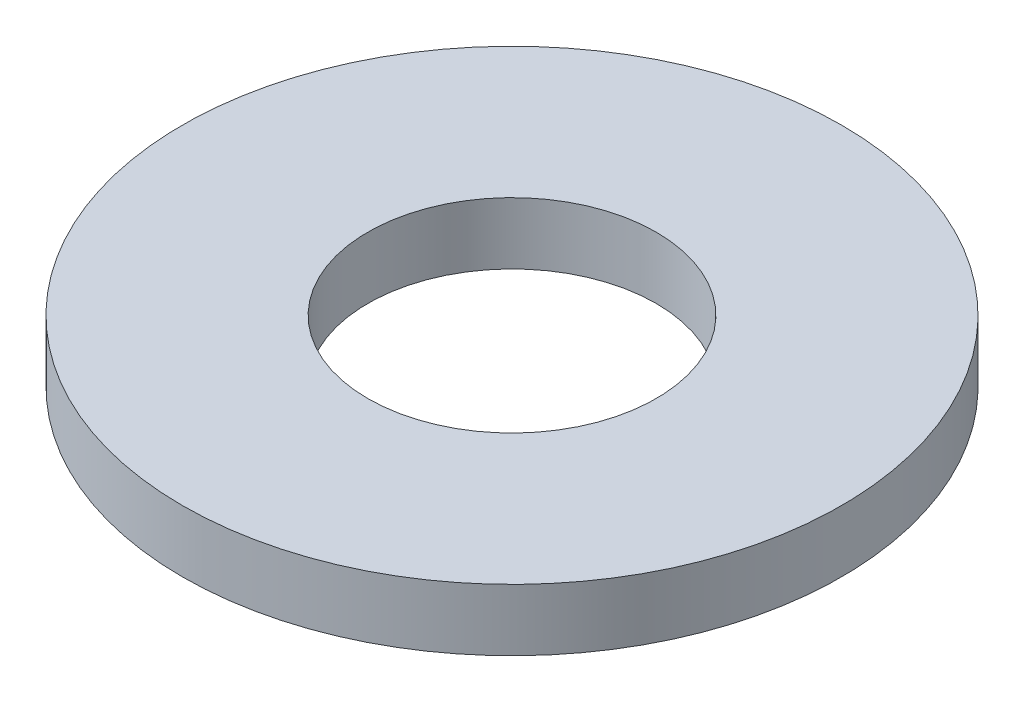
ISO-10303-21;
HEADER;
FILE_DESCRIPTION(('STEP AP214'),'2;1');
FILE_NAME('part.step','',(''),(''),'','','');
FILE_SCHEMA(('AUTOMOTIVE_DESIGN { 1 0 10303 214 1 1 1 1 }'));
ENDSEC;
DATA;
#1=APPLICATION_CONTEXT('core data for automotive mechanical design processes');
#2=APPLICATION_PROTOCOL_DEFINITION('international standard','automotive_design',2000,#1);
#3=PRODUCT_CONTEXT('',#1,'mechanical');
#4=PRODUCT('Part','Part','',(#3));
#5=PRODUCT_RELATED_PRODUCT_CATEGORY('part','',(#4));
#6=PRODUCT_DEFINITION_FORMATION('','',#4);
#7=PRODUCT_DEFINITION_CONTEXT('part definition',#1,'design');
#8=PRODUCT_DEFINITION('design','',#6,#7);
#9=PRODUCT_DEFINITION_SHAPE('','',#8);
#10=(LENGTH_UNIT() NAMED_UNIT(*) SI_UNIT(.MILLI.,.METRE.));
#11=(NAMED_UNIT(*) PLANE_ANGLE_UNIT() SI_UNIT($,.RADIAN.));
#12=(NAMED_UNIT(*) SI_UNIT($,.STERADIAN.) SOLID_ANGLE_UNIT());
#13=UNCERTAINTY_MEASURE_WITH_UNIT(LENGTH_MEASURE(1.E-05),#10,'distance_accuracy_value','');
#14=(GEOMETRIC_REPRESENTATION_CONTEXT(3) GLOBAL_UNCERTAINTY_ASSIGNED_CONTEXT((#13)) GLOBAL_UNIT_ASSIGNED_CONTEXT((#10,
#11,#12)) REPRESENTATION_CONTEXT('',''));
#15=CARTESIAN_POINT('',(0.,0.,0.));
#16=DIRECTION('',(0.,0.,1.));
#17=DIRECTION('',(1.,0.,0.));
#18=AXIS2_PLACEMENT_3D('',#15,#16,#17);
#19=CARTESIAN_POINT('',(0.,1.524,0.));
#20=DIRECTION('',(0.,1.,0.));
#21=DIRECTION('',(0.,0.,1.));
#22=AXIS2_PLACEMENT_3D('',#19,#20,#21);
#23=PLANE('',#22);
#24=CARTESIAN_POINT('',(0.,1.524,0.));
#25=DIRECTION('',(0.,1.,0.));
#26=DIRECTION('',(0.,0.,1.));
#27=AXIS2_PLACEMENT_3D('',#24,#25,#26);
#28=CIRCLE('',#27,8.128);
#29=CARTESIAN_POINT('',(0.,1.524,-8.128));
#30=VERTEX_POINT('',#29);
#31=EDGE_CURVE('E10',#30,#30,#28,.T.);
#32=ORIENTED_EDGE('',*,*,#31,.T.);
#33=EDGE_LOOP('',(#32));
#34=FACE_BOUND('',#33,.T.);
#35=CARTESIAN_POINT('',(0.,1.524,0.));
#36=DIRECTION('',(0.,1.,0.));
#37=DIRECTION('',(0.,0.,1.));
#38=AXIS2_PLACEMENT_3D('',#35,#36,#37);
#39=CIRCLE('',#38,3.556);
#40=CARTESIAN_POINT('',(0.,1.524,-3.556));
#41=VERTEX_POINT('',#40);
#42=EDGE_CURVE('E41',#41,#41,#39,.T.);
#43=ORIENTED_EDGE('',*,*,#42,.F.);
#44=EDGE_LOOP('',(#43));
#45=FACE_BOUND('',#44,.T.);
#46=ADVANCED_FACE('F30',(#34,#45),#23,.T.);
#47=CARTESIAN_POINT('',(0.,0.,0.));
#48=DIRECTION('',(0.,1.,0.));
#49=DIRECTION('',(0.,0.,1.));
#50=AXIS2_PLACEMENT_3D('',#47,#48,#49);
#51=PLANE('',#50);
#52=CARTESIAN_POINT('',(0.,0.,0.));
#53=DIRECTION('',(0.,1.,0.));
#54=DIRECTION('',(0.,0.,1.));
#55=AXIS2_PLACEMENT_3D('',#52,#53,#54);
#56=CIRCLE('',#55,8.128);
#57=CARTESIAN_POINT('',(0.,0.,-8.128));
#58=VERTEX_POINT('',#57);
#59=EDGE_CURVE('E34',#58,#58,#56,.T.);
#60=ORIENTED_EDGE('',*,*,#59,.F.);
#61=EDGE_LOOP('',(#60));
#62=FACE_BOUND('',#61,.T.);
#63=CARTESIAN_POINT('',(0.,0.,0.));
#64=DIRECTION('',(0.,1.,0.));
#65=DIRECTION('',(0.,0.,1.));
#66=AXIS2_PLACEMENT_3D('',#63,#64,#65);
#67=CIRCLE('',#66,3.556);
#68=CARTESIAN_POINT('',(0.,0.,-3.556));
#69=VERTEX_POINT('',#68);
#70=EDGE_CURVE('E43',#69,#69,#67,.T.);
#71=ORIENTED_EDGE('',*,*,#70,.T.);
#72=EDGE_LOOP('',(#71));
#73=FACE_BOUND('',#72,.T.);
#74=ADVANCED_FACE('F53',(#62,#73),#51,.F.);
#75=CARTESIAN_POINT('',(0.,1.524,0.));
#76=DIRECTION('',(0.,-1.,0.));
#77=DIRECTION('',(0.,0.,-1.));
#78=AXIS2_PLACEMENT_3D('',#75,#76,#77);
#79=CYLINDRICAL_SURFACE('',#78,8.128);
#80=CARTESIAN_POINT('',(0.,1.524,-8.128));
#81=CARTESIAN_POINT('',(0.,1.508125,-8.128));
#82=CARTESIAN_POINT('',(0.,1.49225,-8.128));
#83=CARTESIAN_POINT('',(0.,1.4605,-8.128));
#84=CARTESIAN_POINT('',(0.,1.444625,-8.128));
#85=CARTESIAN_POINT('',(0.,1.412875,-8.128));
#86=CARTESIAN_POINT('',(0.,1.397,-8.128));
#87=CARTESIAN_POINT('',(0.,1.36525,-8.128));
#88=CARTESIAN_POINT('',(0.,1.349375,-8.128));
#89=CARTESIAN_POINT('',(0.,1.317625,-8.128));
#90=CARTESIAN_POINT('',(0.,1.30175,-8.128));
#91=CARTESIAN_POINT('',(0.,1.27,-8.128));
#92=CARTESIAN_POINT('',(0.,1.254125,-8.128));
#93=CARTESIAN_POINT('',(0.,1.222375,-8.128));
#94=CARTESIAN_POINT('',(0.,1.2065,-8.128));
#95=CARTESIAN_POINT('',(0.,1.17475,-8.128));
#96=CARTESIAN_POINT('',(0.,1.158875,-8.128));
#97=CARTESIAN_POINT('',(0.,1.127125,-8.128));
#98=CARTESIAN_POINT('',(0.,1.11125,-8.128));
#99=CARTESIAN_POINT('',(0.,1.0795,-8.128));
#100=CARTESIAN_POINT('',(0.,1.063625,-8.128));
#101=CARTESIAN_POINT('',(0.,1.031875,-8.128));
#102=CARTESIAN_POINT('',(0.,1.016,-8.128));
#103=CARTESIAN_POINT('',(0.,0.98425,-8.128));
#104=CARTESIAN_POINT('',(0.,0.968375,-8.128));
#105=CARTESIAN_POINT('',(0.,0.936625,-8.128));
#106=CARTESIAN_POINT('',(0.,0.92075,-8.128));
#107=CARTESIAN_POINT('',(0.,0.889,-8.128));
#108=CARTESIAN_POINT('',(0.,0.873125,-8.128));
#109=CARTESIAN_POINT('',(0.,0.841375,-8.128));
#110=CARTESIAN_POINT('',(0.,0.8255,-8.128));
#111=CARTESIAN_POINT('',(0.,0.79375,-8.128));
#112=CARTESIAN_POINT('',(0.,0.777875,-8.128));
#113=CARTESIAN_POINT('',(0.,0.746125,-8.128));
#114=CARTESIAN_POINT('',(0.,0.73025,-8.128));
#115=CARTESIAN_POINT('',(0.,0.6985,-8.128));
#116=CARTESIAN_POINT('',(0.,0.682625,-8.128));
#117=CARTESIAN_POINT('',(0.,0.650875,-8.128));
#118=CARTESIAN_POINT('',(0.,0.635,-8.128));
#119=CARTESIAN_POINT('',(0.,0.60325,-8.128));
#120=CARTESIAN_POINT('',(0.,0.587375,-8.128));
#121=CARTESIAN_POINT('',(0.,0.555625,-8.128));
#122=CARTESIAN_POINT('',(0.,0.53975,-8.128));
#123=CARTESIAN_POINT('',(0.,0.508,-8.128));
#124=CARTESIAN_POINT('',(0.,0.492125,-8.128));
#125=CARTESIAN_POINT('',(0.,0.460375,-8.128));
#126=CARTESIAN_POINT('',(0.,0.4445,-8.128));
#127=CARTESIAN_POINT('',(0.,0.41275,-8.128));
#128=CARTESIAN_POINT('',(0.,0.396875,-8.128));
#129=CARTESIAN_POINT('',(0.,0.365125,-8.128));
#130=CARTESIAN_POINT('',(0.,0.34925,-8.128));
#131=CARTESIAN_POINT('',(0.,0.3175,-8.128));
#132=CARTESIAN_POINT('',(0.,0.301625,-8.128));
#133=CARTESIAN_POINT('',(0.,0.269875,-8.128));
#134=CARTESIAN_POINT('',(0.,0.254,-8.128));
#135=CARTESIAN_POINT('',(0.,0.22225,-8.128));
#136=CARTESIAN_POINT('',(0.,0.206375,-8.128));
#137=CARTESIAN_POINT('',(0.,0.174625,-8.128));
#138=CARTESIAN_POINT('',(0.,0.15875,-8.128));
#139=CARTESIAN_POINT('',(0.,0.127,-8.128));
#140=CARTESIAN_POINT('',(0.,0.111125,-8.128));
#141=CARTESIAN_POINT('',(0.,0.079375,-8.128));
#142=CARTESIAN_POINT('',(0.,0.0635,-8.128));
#143=CARTESIAN_POINT('',(0.,0.0317499999999999,-8.128));
#144=CARTESIAN_POINT('',(0.,0.015875,-8.128));
#145=CARTESIAN_POINT('',(0.,0.,-8.128));
#146=B_SPLINE_CURVE_WITH_KNOTS('',3,(#80,#81,#82,#83,#84,#85,#86,#87,#88,#89,#90,#91,#92,#93,
#94,#95,#96,#97,#98,#99,#100,#101,#102,#103,#104,#105,#106,#107,#108,#109,#110,#111,#112,#113,
#114,#115,#116,#117,#118,#119,#120,#121,#122,#123,#124,#125,#126,#127,#128,#129,#130,#131,#132,
#133,#134,#135,#136,#137,#138,#139,#140,#141,#142,#143,#144,#145),.UNSPECIFIED.,.F.,.F.,(4,2,2,
2,2,2,2,2,2,2,2,2,2,2,2,2,2,2,2,2,2,2,2,2,2,2,2,2,2,2,2,2,4),(0.,0.0476249999999999,
0.0952499999999998,0.142875,0.1905,0.238125,0.28575,0.333375,0.381,0.428625,0.47625,0.523875,
0.5715,0.619125,0.66675,0.714375,0.762,0.809625,0.85725,0.904875,0.9525,1.000125,1.04775,
1.095375,1.143,1.190625,1.23825,1.285875,1.3335,1.381125,1.42875,1.476375,1.524),.UNSPECIFIED.);
#147=EDGE_CURVE('BSEAM32',#30,#58,#146,.T.);
#148=ORIENTED_EDGE('',*,*,#31,.F.);
#149=ORIENTED_EDGE('',*,*,#59,.T.);
#150=ORIENTED_EDGE('',*,*,#147,.T.);
#151=ORIENTED_EDGE('',*,*,#147,.F.);
#152=EDGE_LOOP('',(#148,#150,#149,#151));
#153=FACE_BOUND('',#152,.T.);
#154=ADVANCED_FACE('F32',(#153),#79,.T.);
#155=CARTESIAN_POINT('',(0.,1.524,0.));
#156=DIRECTION('',(0.,-1.,0.));
#157=DIRECTION('',(0.,0.,-1.));
#158=AXIS2_PLACEMENT_3D('',#155,#156,#157);
#159=CYLINDRICAL_SURFACE('',#158,3.556);
#160=CARTESIAN_POINT('',(0.,1.524,-3.556));
#161=CARTESIAN_POINT('',(0.,1.508125,-3.556));
#162=CARTESIAN_POINT('',(0.,1.49225,-3.556));
#163=CARTESIAN_POINT('',(0.,1.4605,-3.556));
#164=CARTESIAN_POINT('',(0.,1.444625,-3.556));
#165=CARTESIAN_POINT('',(0.,1.412875,-3.556));
#166=CARTESIAN_POINT('',(0.,1.397,-3.556));
#167=CARTESIAN_POINT('',(0.,1.36525,-3.556));
#168=CARTESIAN_POINT('',(0.,1.349375,-3.556));
#169=CARTESIAN_POINT('',(0.,1.317625,-3.556));
#170=CARTESIAN_POINT('',(0.,1.30175,-3.556));
#171=CARTESIAN_POINT('',(0.,1.27,-3.556));
#172=CARTESIAN_POINT('',(0.,1.254125,-3.556));
#173=CARTESIAN_POINT('',(0.,1.222375,-3.556));
#174=CARTESIAN_POINT('',(0.,1.2065,-3.556));
#175=CARTESIAN_POINT('',(0.,1.17475,-3.556));
#176=CARTESIAN_POINT('',(0.,1.158875,-3.556));
#177=CARTESIAN_POINT('',(0.,1.127125,-3.556));
#178=CARTESIAN_POINT('',(0.,1.11125,-3.556));
#179=CARTESIAN_POINT('',(0.,1.0795,-3.556));
#180=CARTESIAN_POINT('',(0.,1.063625,-3.556));
#181=CARTESIAN_POINT('',(0.,1.031875,-3.556));
#182=CARTESIAN_POINT('',(0.,1.016,-3.556));
#183=CARTESIAN_POINT('',(0.,0.98425,-3.556));
#184=CARTESIAN_POINT('',(0.,0.968375,-3.556));
#185=CARTESIAN_POINT('',(0.,0.936625,-3.556));
#186=CARTESIAN_POINT('',(0.,0.92075,-3.556));
#187=CARTESIAN_POINT('',(0.,0.889,-3.556));
#188=CARTESIAN_POINT('',(0.,0.873125,-3.556));
#189=CARTESIAN_POINT('',(0.,0.841375,-3.556));
#190=CARTESIAN_POINT('',(0.,0.8255,-3.556));
#191=CARTESIAN_POINT('',(0.,0.79375,-3.556));
#192=CARTESIAN_POINT('',(0.,0.777875,-3.556));
#193=CARTESIAN_POINT('',(0.,0.746125,-3.556));
#194=CARTESIAN_POINT('',(0.,0.73025,-3.556));
#195=CARTESIAN_POINT('',(0.,0.6985,-3.556));
#196=CARTESIAN_POINT('',(0.,0.682625,-3.556));
#197=CARTESIAN_POINT('',(0.,0.650875,-3.556));
#198=CARTESIAN_POINT('',(0.,0.635,-3.556));
#199=CARTESIAN_POINT('',(0.,0.60325,-3.556));
#200=CARTESIAN_POINT('',(0.,0.587375,-3.556));
#201=CARTESIAN_POINT('',(0.,0.555625,-3.556));
#202=CARTESIAN_POINT('',(0.,0.53975,-3.556));
#203=CARTESIAN_POINT('',(0.,0.508,-3.556));
#204=CARTESIAN_POINT('',(0.,0.492125,-3.556));
#205=CARTESIAN_POINT('',(0.,0.460375,-3.556));
#206=CARTESIAN_POINT('',(0.,0.4445,-3.556));
#207=CARTESIAN_POINT('',(0.,0.41275,-3.556));
#208=CARTESIAN_POINT('',(0.,0.396875,-3.556));
#209=CARTESIAN_POINT('',(0.,0.365125,-3.556));
#210=CARTESIAN_POINT('',(0.,0.34925,-3.556));
#211=CARTESIAN_POINT('',(0.,0.3175,-3.556));
#212=CARTESIAN_POINT('',(0.,0.301625,-3.556));
#213=CARTESIAN_POINT('',(0.,0.269875,-3.556));
#214=CARTESIAN_POINT('',(0.,0.254,-3.556));
#215=CARTESIAN_POINT('',(0.,0.22225,-3.556));
#216=CARTESIAN_POINT('',(0.,0.206375,-3.556));
#217=CARTESIAN_POINT('',(0.,0.174625,-3.556));
#218=CARTESIAN_POINT('',(0.,0.15875,-3.556));
#219=CARTESIAN_POINT('',(0.,0.127,-3.556));
#220=CARTESIAN_POINT('',(0.,0.111125,-3.556));
#221=CARTESIAN_POINT('',(0.,0.079375,-3.556));
#222=CARTESIAN_POINT('',(0.,0.0635,-3.556));
#223=CARTESIAN_POINT('',(0.,0.0317499999999999,-3.556));
#224=CARTESIAN_POINT('',(0.,0.015875,-3.556));
#225=CARTESIAN_POINT('',(0.,0.,-3.556));
#226=B_SPLINE_CURVE_WITH_KNOTS('',3,(#160,#161,#162,#163,#164,#165,#166,#167,#168,#169,#170,
#171,#172,#173,#174,#175,#176,#177,#178,#179,#180,#181,#182,#183,#184,#185,#186,#187,#188,#189,
#190,#191,#192,#193,#194,#195,#196,#197,#198,#199,#200,#201,#202,#203,#204,#205,#206,#207,#208,
#209,#210,#211,#212,#213,#214,#215,#216,#217,#218,#219,#220,#221,#222,#223,#224,#225),
.UNSPECIFIED.,.F.,.F.,(4,2,2,2,2,2,2,2,2,2,2,2,2,2,2,2,2,2,2,2,2,2,2,2,2,2,2,2,2,2,2,2,4),(0.,
0.0476249999999999,0.0952499999999998,0.142875,0.1905,0.238125,0.28575,0.333375,0.381,0.428625,
0.47625,0.523875,0.5715,0.619125,0.66675,0.714375,0.762,0.809625,0.85725,0.904875,0.9525,
1.000125,1.04775,1.095375,1.143,1.190625,1.23825,1.285875,1.3335,1.381125,1.42875,1.476375,
1.524),.UNSPECIFIED.);
#227=EDGE_CURVE('BSEAM49',#41,#69,#226,.T.);
#228=ORIENTED_EDGE('',*,*,#42,.T.);
#229=ORIENTED_EDGE('',*,*,#70,.F.);
#230=ORIENTED_EDGE('',*,*,#227,.T.);
#231=ORIENTED_EDGE('',*,*,#227,.F.);
#232=EDGE_LOOP('',(#228,#230,#229,#231));
#233=FACE_BOUND('',#232,.T.);
#234=ADVANCED_FACE('F49',(#233),#159,.F.);
#235=CLOSED_SHELL('',(#46,#74,#154,#234));
#236=MANIFOLD_SOLID_BREP('B2',#235);
#237=ADVANCED_BREP_SHAPE_REPRESENTATION('',(#18,#236),#14);
#238=SHAPE_DEFINITION_REPRESENTATION(#9,#237);
ENDSEC;
END-ISO-10303-21;
